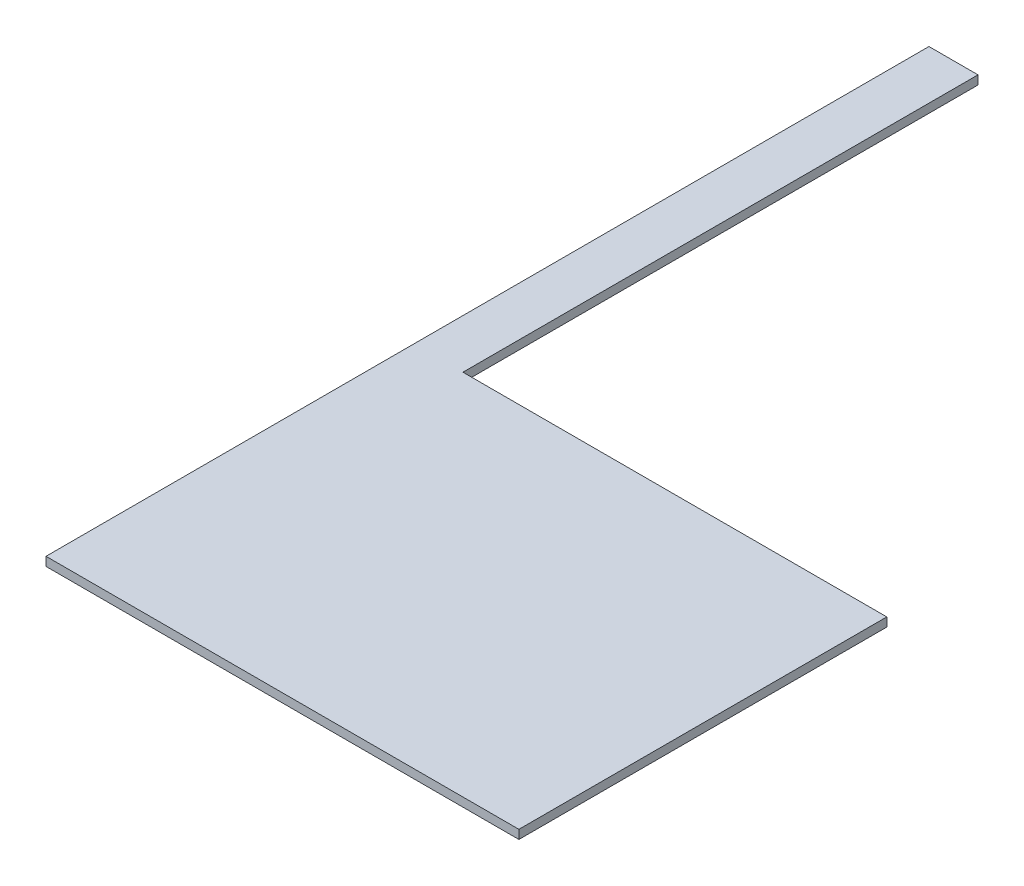
ISO-10303-21;
HEADER;
FILE_DESCRIPTION(('STEP AP214'),'2;1');
FILE_NAME('part.step','',(''),(''),'','','');
FILE_SCHEMA(('AUTOMOTIVE_DESIGN { 1 0 10303 214 1 1 1 1 }'));
ENDSEC;
DATA;
#1=APPLICATION_CONTEXT('core data for automotive mechanical design processes');
#2=APPLICATION_PROTOCOL_DEFINITION('international standard','automotive_design',2000,#1);
#3=PRODUCT_CONTEXT('',#1,'mechanical');
#4=PRODUCT('Part','Part','',(#3));
#5=PRODUCT_RELATED_PRODUCT_CATEGORY('part','',(#4));
#6=PRODUCT_DEFINITION_FORMATION('','',#4);
#7=PRODUCT_DEFINITION_CONTEXT('part definition',#1,'design');
#8=PRODUCT_DEFINITION('design','',#6,#7);
#9=PRODUCT_DEFINITION_SHAPE('','',#8);
#10=(LENGTH_UNIT() NAMED_UNIT(*) SI_UNIT(.MILLI.,.METRE.));
#11=(NAMED_UNIT(*) PLANE_ANGLE_UNIT() SI_UNIT($,.RADIAN.));
#12=(NAMED_UNIT(*) SI_UNIT($,.STERADIAN.) SOLID_ANGLE_UNIT());
#13=UNCERTAINTY_MEASURE_WITH_UNIT(LENGTH_MEASURE(1.E-05),#10,'distance_accuracy_value','');
#14=(GEOMETRIC_REPRESENTATION_CONTEXT(3) GLOBAL_UNCERTAINTY_ASSIGNED_CONTEXT((#13)) GLOBAL_UNIT_ASSIGNED_CONTEXT((#10,
#11,#12)) REPRESENTATION_CONTEXT('',''));
#15=CARTESIAN_POINT('',(0.,0.,0.));
#16=DIRECTION('',(0.,0.,1.));
#17=DIRECTION('',(1.,0.,0.));
#18=AXIS2_PLACEMENT_3D('',#15,#16,#17);
#19=CARTESIAN_POINT('',(489.74375,18.25625,-381.));
#20=DIRECTION('',(0.,0.,1.));
#21=DIRECTION('',(1.,0.,0.));
#22=AXIS2_PLACEMENT_3D('',#19,#20,#21);
#23=PLANE('',#22);
#24=DIRECTION('',(-1.,0.,0.));
#25=VECTOR('',#24,1.);
#26=CARTESIAN_POINT('',(489.74375,0.,-381.));
#27=LINE('',#26,#25);
#28=CARTESIAN_POINT('',(489.74375,0.,-381.));
#29=VERTEX_POINT('',#28);
#30=CARTESIAN_POINT('',(-388.14375,0.,-381.));
#31=VERTEX_POINT('',#30);
#32=EDGE_CURVE('E127',#29,#31,#27,.T.);
#33=ORIENTED_EDGE('',*,*,#32,.T.);
#34=DIRECTION('',(0.,-1.,0.));
#35=VECTOR('',#34,1.);
#36=CARTESIAN_POINT('',(-388.14375,18.25625,-381.));
#37=LINE('',#36,#35);
#38=CARTESIAN_POINT('',(-388.14375,18.25625,-381.));
#39=VERTEX_POINT('',#38);
#40=EDGE_CURVE('E11',#39,#31,#37,.T.);
#41=ORIENTED_EDGE('',*,*,#40,.F.);
#42=DIRECTION('',(-1.,0.,0.));
#43=VECTOR('',#42,1.);
#44=CARTESIAN_POINT('',(489.74375,18.25625,-381.));
#45=LINE('',#44,#43);
#46=CARTESIAN_POINT('',(489.74375,18.25625,-381.));
#47=VERTEX_POINT('',#46);
#48=EDGE_CURVE('E144',#47,#39,#45,.T.);
#49=ORIENTED_EDGE('',*,*,#48,.F.);
#50=DIRECTION('',(0.,-1.,0.));
#51=VECTOR('',#50,1.);
#52=CARTESIAN_POINT('',(489.74375,18.25625,-381.));
#53=LINE('',#52,#51);
#54=EDGE_CURVE('E123',#47,#29,#53,.T.);
#55=ORIENTED_EDGE('',*,*,#54,.T.);
#56=EDGE_LOOP('',(#33,#41,#49,#55));
#57=FACE_BOUND('',#56,.T.);
#58=ADVANCED_FACE('F39',(#57),#23,.F.);
#59=CARTESIAN_POINT('',(-388.14375,18.25625,-1447.8));
#60=DIRECTION('',(-1.,0.,0.));
#61=DIRECTION('',(0.,0.,1.));
#62=AXIS2_PLACEMENT_3D('',#59,#60,#61);
#63=PLANE('',#62);
#64=DIRECTION('',(0.,0.,-1.));
#65=VECTOR('',#64,1.);
#66=CARTESIAN_POINT('',(-388.14375,0.,-1447.8));
#67=LINE('',#66,#65);
#68=CARTESIAN_POINT('',(-388.14375,0.,-1447.8));
#69=VERTEX_POINT('',#68);
#70=EDGE_CURVE('E131',#31,#69,#67,.T.);
#71=ORIENTED_EDGE('',*,*,#70,.T.);
#72=DIRECTION('',(0.,-1.,0.));
#73=VECTOR('',#72,1.);
#74=CARTESIAN_POINT('',(-388.14375,18.25625,-1447.8));
#75=LINE('',#74,#73);
#76=CARTESIAN_POINT('',(-388.14375,18.25625,-1447.8));
#77=VERTEX_POINT('',#76);
#78=EDGE_CURVE('E48',#77,#69,#75,.T.);
#79=ORIENTED_EDGE('',*,*,#78,.F.);
#80=DIRECTION('',(0.,0.,-1.));
#81=VECTOR('',#80,1.);
#82=CARTESIAN_POINT('',(-388.14375,18.25625,-1447.8));
#83=LINE('',#82,#81);
#84=EDGE_CURVE('E93',#39,#77,#83,.T.);
#85=ORIENTED_EDGE('',*,*,#84,.F.);
#86=ORIENTED_EDGE('',*,*,#40,.T.);
#87=EDGE_LOOP('',(#71,#79,#85,#86));
#88=FACE_BOUND('',#87,.T.);
#89=ADVANCED_FACE('F172',(#88),#63,.F.);
#90=CARTESIAN_POINT('',(-489.74375,18.25625,-1447.8));
#91=DIRECTION('',(0.,0.,1.));
#92=DIRECTION('',(1.,0.,0.));
#93=AXIS2_PLACEMENT_3D('',#90,#91,#92);
#94=PLANE('',#93);
#95=DIRECTION('',(-1.,0.,0.));
#96=VECTOR('',#95,1.);
#97=CARTESIAN_POINT('',(-489.74375,0.,-1447.8));
#98=LINE('',#97,#96);
#99=CARTESIAN_POINT('',(-489.74375,0.,-1447.8));
#100=VERTEX_POINT('',#99);
#101=EDGE_CURVE('E134',#69,#100,#98,.T.);
#102=ORIENTED_EDGE('',*,*,#101,.T.);
#103=DIRECTION('',(0.,-1.,0.));
#104=VECTOR('',#103,1.);
#105=CARTESIAN_POINT('',(-489.74375,18.25625,-1447.8));
#106=LINE('',#105,#104);
#107=CARTESIAN_POINT('',(-489.74375,18.25625,-1447.8));
#108=VERTEX_POINT('',#107);
#109=EDGE_CURVE('E116',#108,#100,#106,.T.);
#110=ORIENTED_EDGE('',*,*,#109,.F.);
#111=DIRECTION('',(-1.,0.,0.));
#112=VECTOR('',#111,1.);
#113=CARTESIAN_POINT('',(-489.74375,18.25625,-1447.8));
#114=LINE('',#113,#112);
#115=EDGE_CURVE('E106',#77,#108,#114,.T.);
#116=ORIENTED_EDGE('',*,*,#115,.F.);
#117=ORIENTED_EDGE('',*,*,#78,.T.);
#118=EDGE_LOOP('',(#102,#110,#116,#117));
#119=FACE_BOUND('',#118,.T.);
#120=ADVANCED_FACE('F154',(#119),#94,.F.);
#121=CARTESIAN_POINT('',(-489.74375,18.25625,381.));
#122=DIRECTION('',(1.,0.,0.));
#123=DIRECTION('',(0.,0.,-1.));
#124=AXIS2_PLACEMENT_3D('',#121,#122,#123);
#125=PLANE('',#124);
#126=DIRECTION('',(0.,0.,1.));
#127=VECTOR('',#126,1.);
#128=CARTESIAN_POINT('',(-489.74375,0.,381.));
#129=LINE('',#128,#127);
#130=CARTESIAN_POINT('',(-489.74375,0.,381.));
#131=VERTEX_POINT('',#130);
#132=EDGE_CURVE('E114',#100,#131,#129,.T.);
#133=ORIENTED_EDGE('',*,*,#132,.T.);
#134=DIRECTION('',(0.,-1.,0.));
#135=VECTOR('',#134,1.);
#136=CARTESIAN_POINT('',(-489.74375,18.25625,381.));
#137=LINE('',#136,#135);
#138=CARTESIAN_POINT('',(-489.74375,18.25625,381.));
#139=VERTEX_POINT('',#138);
#140=EDGE_CURVE('E112',#139,#131,#137,.T.);
#141=ORIENTED_EDGE('',*,*,#140,.F.);
#142=DIRECTION('',(0.,0.,1.));
#143=VECTOR('',#142,1.);
#144=CARTESIAN_POINT('',(-489.74375,18.25625,-381.));
#145=LINE('',#144,#143);
#146=EDGE_CURVE('E100',#108,#139,#145,.T.);
#147=ORIENTED_EDGE('',*,*,#146,.F.);
#148=ORIENTED_EDGE('',*,*,#109,.T.);
#149=EDGE_LOOP('',(#133,#141,#147,#148));
#150=FACE_BOUND('',#149,.T.);
#151=ADVANCED_FACE('F113',(#150),#125,.F.);
#152=CARTESIAN_POINT('',(-489.74375,18.25625,381.));
#153=DIRECTION('',(0.,0.,-1.));
#154=DIRECTION('',(-1.,0.,0.));
#155=AXIS2_PLACEMENT_3D('',#152,#153,#154);
#156=PLANE('',#155);
#157=DIRECTION('',(1.,0.,0.));
#158=VECTOR('',#157,1.);
#159=CARTESIAN_POINT('',(-489.74375,0.,381.));
#160=LINE('',#159,#158);
#161=CARTESIAN_POINT('',(489.74375,0.,381.));
#162=VERTEX_POINT('',#161);
#163=EDGE_CURVE('E79',#131,#162,#160,.T.);
#164=ORIENTED_EDGE('',*,*,#163,.T.);
#165=DIRECTION('',(0.,-1.,0.));
#166=VECTOR('',#165,1.);
#167=CARTESIAN_POINT('',(489.74375,18.25625,381.));
#168=LINE('',#167,#166);
#169=CARTESIAN_POINT('',(489.74375,18.25625,381.));
#170=VERTEX_POINT('',#169);
#171=EDGE_CURVE('E117',#170,#162,#168,.T.);
#172=ORIENTED_EDGE('',*,*,#171,.F.);
#173=DIRECTION('',(1.,0.,0.));
#174=VECTOR('',#173,1.);
#175=CARTESIAN_POINT('',(-489.74375,18.25625,381.));
#176=LINE('',#175,#174);
#177=EDGE_CURVE('E104',#139,#170,#176,.T.);
#178=ORIENTED_EDGE('',*,*,#177,.F.);
#179=ORIENTED_EDGE('',*,*,#140,.T.);
#180=EDGE_LOOP('',(#164,#172,#178,#179));
#181=FACE_BOUND('',#180,.T.);
#182=ADVANCED_FACE('F119',(#181),#156,.F.);
#183=CARTESIAN_POINT('',(489.74375,18.25625,381.));
#184=DIRECTION('',(-1.,0.,0.));
#185=DIRECTION('',(0.,0.,1.));
#186=AXIS2_PLACEMENT_3D('',#183,#184,#185);
#187=PLANE('',#186);
#188=DIRECTION('',(0.,0.,-1.));
#189=VECTOR('',#188,1.);
#190=CARTESIAN_POINT('',(489.74375,0.,381.));
#191=LINE('',#190,#189);
#192=EDGE_CURVE('E85',#162,#29,#191,.T.);
#193=ORIENTED_EDGE('',*,*,#192,.T.);
#194=ORIENTED_EDGE('',*,*,#54,.F.);
#195=DIRECTION('',(0.,0.,-1.));
#196=VECTOR('',#195,1.);
#197=CARTESIAN_POINT('',(489.74375,18.25625,381.));
#198=LINE('',#197,#196);
#199=EDGE_CURVE('E56',#170,#47,#198,.T.);
#200=ORIENTED_EDGE('',*,*,#199,.F.);
#201=ORIENTED_EDGE('',*,*,#171,.T.);
#202=EDGE_LOOP('',(#193,#194,#200,#201));
#203=FACE_BOUND('',#202,.T.);
#204=ADVANCED_FACE('F161',(#203),#187,.F.);
#205=CARTESIAN_POINT('',(0.,18.25625,0.));
#206=DIRECTION('',(0.,1.,0.));
#207=DIRECTION('',(0.,0.,1.));
#208=AXIS2_PLACEMENT_3D('',#205,#206,#207);
#209=PLANE('',#208);
#210=ORIENTED_EDGE('',*,*,#48,.T.);
#211=ORIENTED_EDGE('',*,*,#84,.T.);
#212=ORIENTED_EDGE('',*,*,#115,.T.);
#213=ORIENTED_EDGE('',*,*,#146,.T.);
#214=ORIENTED_EDGE('',*,*,#177,.T.);
#215=ORIENTED_EDGE('',*,*,#199,.T.);
#216=EDGE_LOOP('',(#210,#211,#212,#213,#214,#215));
#217=FACE_BOUND('',#216,.T.);
#218=ADVANCED_FACE('F102',(#217),#209,.T.);
#219=CARTESIAN_POINT('',(0.,0.,0.));
#220=DIRECTION('',(0.,1.,0.));
#221=DIRECTION('',(0.,0.,1.));
#222=AXIS2_PLACEMENT_3D('',#219,#220,#221);
#223=PLANE('',#222);
#224=ORIENTED_EDGE('',*,*,#32,.F.);
#225=ORIENTED_EDGE('',*,*,#192,.F.);
#226=ORIENTED_EDGE('',*,*,#163,.F.);
#227=ORIENTED_EDGE('',*,*,#132,.F.);
#228=ORIENTED_EDGE('',*,*,#101,.F.);
#229=ORIENTED_EDGE('',*,*,#70,.F.);
#230=EDGE_LOOP('',(#224,#225,#226,#227,#228,#229));
#231=FACE_BOUND('',#230,.T.);
#232=ADVANCED_FACE('F157',(#231),#223,.F.);
#233=CLOSED_SHELL('',(#58,#89,#120,#151,#182,#204,#218,#232));
#234=MANIFOLD_SOLID_BREP('B2',#233);
#235=ADVANCED_BREP_SHAPE_REPRESENTATION('',(#18,#234),#14);
#236=SHAPE_DEFINITION_REPRESENTATION(#9,#235);
ENDSEC;
END-ISO-10303-21;
